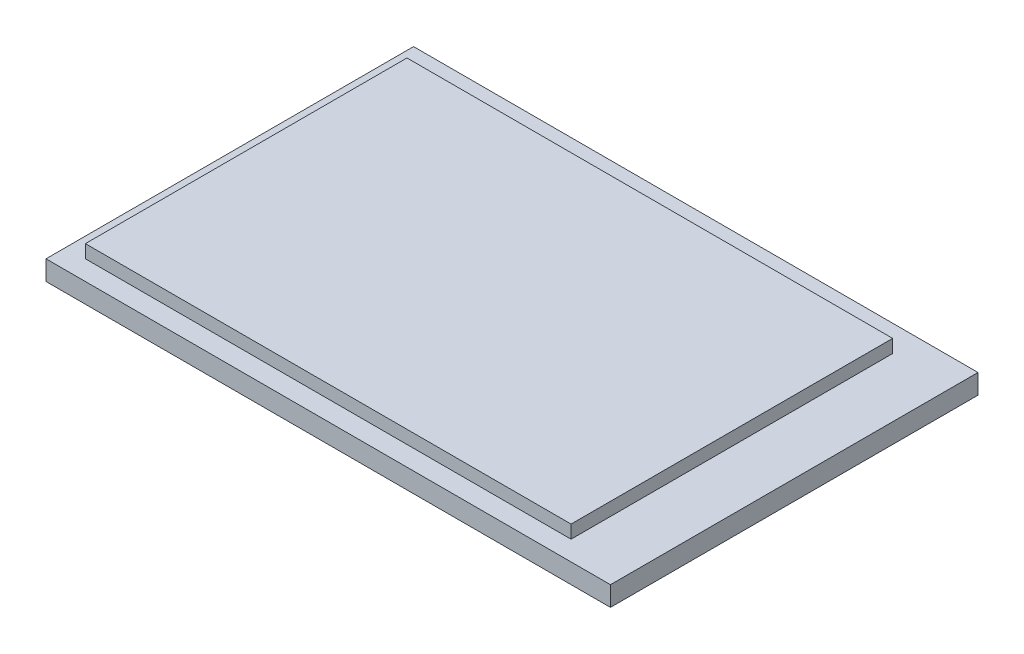
ISO-10303-21;
HEADER;
FILE_DESCRIPTION(('STEP AP214'),'2;1');
FILE_NAME('part.step','',(''),(''),'','','');
FILE_SCHEMA(('AUTOMOTIVE_DESIGN { 1 0 10303 214 1 1 1 1 }'));
ENDSEC;
DATA;
#1=APPLICATION_CONTEXT('core data for automotive mechanical design processes');
#2=APPLICATION_PROTOCOL_DEFINITION('international standard','automotive_design',2000,#1);
#3=PRODUCT_CONTEXT('',#1,'mechanical');
#4=PRODUCT('Part','Part','',(#3));
#5=PRODUCT_RELATED_PRODUCT_CATEGORY('part','',(#4));
#6=PRODUCT_DEFINITION_FORMATION('','',#4);
#7=PRODUCT_DEFINITION_CONTEXT('part definition',#1,'design');
#8=PRODUCT_DEFINITION('design','',#6,#7);
#9=PRODUCT_DEFINITION_SHAPE('','',#8);
#10=(LENGTH_UNIT() NAMED_UNIT(*) SI_UNIT(.MILLI.,.METRE.));
#11=(NAMED_UNIT(*) PLANE_ANGLE_UNIT() SI_UNIT($,.RADIAN.));
#12=(NAMED_UNIT(*) SI_UNIT($,.STERADIAN.) SOLID_ANGLE_UNIT());
#13=UNCERTAINTY_MEASURE_WITH_UNIT(LENGTH_MEASURE(1.E-05),#10,'distance_accuracy_value','');
#14=(GEOMETRIC_REPRESENTATION_CONTEXT(3) GLOBAL_UNCERTAINTY_ASSIGNED_CONTEXT((#13)) GLOBAL_UNIT_ASSIGNED_CONTEXT((#10,
#11,#12)) REPRESENTATION_CONTEXT('',''));
#15=CARTESIAN_POINT('',(0.,0.,0.));
#16=DIRECTION('',(0.,0.,1.));
#17=DIRECTION('',(1.,0.,0.));
#18=AXIS2_PLACEMENT_3D('',#15,#16,#17);
#19=CARTESIAN_POINT('',(46.,-3.,-28.5));
#20=DIRECTION('',(-1.,0.,0.));
#21=DIRECTION('',(0.,0.,1.));
#22=AXIS2_PLACEMENT_3D('',#19,#20,#21);
#23=PLANE('',#22);
#24=DIRECTION('',(0.,0.,1.));
#25=VECTOR('',#24,1.);
#26=CARTESIAN_POINT('',(46.,0.,-28.5));
#27=LINE('',#26,#25);
#28=CARTESIAN_POINT('',(46.,0.,-28.5));
#29=VERTEX_POINT('',#28);
#30=CARTESIAN_POINT('',(46.,0.,27.5));
#31=VERTEX_POINT('',#30);
#32=EDGE_CURVE('E108',#29,#31,#27,.T.);
#33=ORIENTED_EDGE('',*,*,#32,.T.);
#34=DIRECTION('',(0.,1.,0.));
#35=VECTOR('',#34,1.);
#36=CARTESIAN_POINT('',(46.,-3.,27.5));
#37=LINE('',#36,#35);
#38=CARTESIAN_POINT('',(46.,-3.,27.5));
#39=VERTEX_POINT('',#38);
#40=EDGE_CURVE('E12',#39,#31,#37,.T.);
#41=ORIENTED_EDGE('',*,*,#40,.F.);
#42=DIRECTION('',(0.,0.,1.));
#43=VECTOR('',#42,1.);
#44=CARTESIAN_POINT('',(46.,-3.,-28.5));
#45=LINE('',#44,#43);
#46=CARTESIAN_POINT('',(46.,-3.,-28.5));
#47=VERTEX_POINT('',#46);
#48=EDGE_CURVE('E96',#47,#39,#45,.T.);
#49=ORIENTED_EDGE('',*,*,#48,.F.);
#50=DIRECTION('',(0.,1.,0.));
#51=VECTOR('',#50,1.);
#52=CARTESIAN_POINT('',(46.,-3.,-28.5));
#53=LINE('',#52,#51);
#54=EDGE_CURVE('E104',#47,#29,#53,.T.);
#55=ORIENTED_EDGE('',*,*,#54,.T.);
#56=EDGE_LOOP('',(#33,#41,#49,#55));
#57=FACE_BOUND('',#56,.T.);
#58=ADVANCED_FACE('F45',(#57),#23,.F.);
#59=CARTESIAN_POINT('',(-40.,-3.,27.5));
#60=DIRECTION('',(0.,0.,-1.));
#61=DIRECTION('',(-1.,0.,0.));
#62=AXIS2_PLACEMENT_3D('',#59,#60,#61);
#63=PLANE('',#62);
#64=DIRECTION('',(-1.,0.,0.));
#65=VECTOR('',#64,1.);
#66=CARTESIAN_POINT('',(-40.,0.,27.5));
#67=LINE('',#66,#65);
#68=CARTESIAN_POINT('',(-40.,0.,27.5));
#69=VERTEX_POINT('',#68);
#70=EDGE_CURVE('E100',#31,#69,#67,.T.);
#71=ORIENTED_EDGE('',*,*,#70,.T.);
#72=DIRECTION('',(0.,1.,0.));
#73=VECTOR('',#72,1.);
#74=CARTESIAN_POINT('',(-40.,-3.,27.5));
#75=LINE('',#74,#73);
#76=CARTESIAN_POINT('',(-40.,-3.,27.5));
#77=VERTEX_POINT('',#76);
#78=EDGE_CURVE('E53',#77,#69,#75,.T.);
#79=ORIENTED_EDGE('',*,*,#78,.F.);
#80=DIRECTION('',(-1.,0.,0.));
#81=VECTOR('',#80,1.);
#82=CARTESIAN_POINT('',(-40.,-3.,27.5));
#83=LINE('',#82,#81);
#84=EDGE_CURVE('E91',#39,#77,#83,.T.);
#85=ORIENTED_EDGE('',*,*,#84,.F.);
#86=ORIENTED_EDGE('',*,*,#40,.T.);
#87=EDGE_LOOP('',(#71,#79,#85,#86));
#88=FACE_BOUND('',#87,.T.);
#89=ADVANCED_FACE('F99',(#88),#63,.F.);
#90=CARTESIAN_POINT('',(-40.,-3.,-28.5));
#91=DIRECTION('',(1.,0.,0.));
#92=DIRECTION('',(0.,0.,-1.));
#93=AXIS2_PLACEMENT_3D('',#90,#91,#92);
#94=PLANE('',#93);
#95=DIRECTION('',(0.,0.,-1.));
#96=VECTOR('',#95,1.);
#97=CARTESIAN_POINT('',(-40.,0.,-28.5));
#98=LINE('',#97,#96);
#99=CARTESIAN_POINT('',(-40.,0.,-28.5));
#100=VERTEX_POINT('',#99);
#101=EDGE_CURVE('E78',#69,#100,#98,.T.);
#102=ORIENTED_EDGE('',*,*,#101,.T.);
#103=DIRECTION('',(0.,1.,0.));
#104=VECTOR('',#103,1.);
#105=CARTESIAN_POINT('',(-40.,-3.,-28.5));
#106=LINE('',#105,#104);
#107=CARTESIAN_POINT('',(-40.,-3.,-28.5));
#108=VERTEX_POINT('',#107);
#109=EDGE_CURVE('E101',#108,#100,#106,.T.);
#110=ORIENTED_EDGE('',*,*,#109,.F.);
#111=DIRECTION('',(0.,0.,-1.));
#112=VECTOR('',#111,1.);
#113=CARTESIAN_POINT('',(-40.,-3.,-28.5));
#114=LINE('',#113,#112);
#115=EDGE_CURVE('E94',#77,#108,#114,.T.);
#116=ORIENTED_EDGE('',*,*,#115,.F.);
#117=ORIENTED_EDGE('',*,*,#78,.T.);
#118=EDGE_LOOP('',(#102,#110,#116,#117));
#119=FACE_BOUND('',#118,.T.);
#120=ADVANCED_FACE('F102',(#119),#94,.F.);
#121=CARTESIAN_POINT('',(-40.,-3.,-28.5));
#122=DIRECTION('',(0.,0.,1.));
#123=DIRECTION('',(1.,0.,0.));
#124=AXIS2_PLACEMENT_3D('',#121,#122,#123);
#125=PLANE('',#124);
#126=DIRECTION('',(1.,0.,0.));
#127=VECTOR('',#126,1.);
#128=CARTESIAN_POINT('',(-40.,0.,-28.5));
#129=LINE('',#128,#127);
#130=EDGE_CURVE('E84',#100,#29,#129,.T.);
#131=ORIENTED_EDGE('',*,*,#130,.T.);
#132=ORIENTED_EDGE('',*,*,#54,.F.);
#133=DIRECTION('',(1.,0.,0.));
#134=VECTOR('',#133,1.);
#135=CARTESIAN_POINT('',(-40.,-3.,-28.5));
#136=LINE('',#135,#134);
#137=EDGE_CURVE('E61',#108,#47,#136,.T.);
#138=ORIENTED_EDGE('',*,*,#137,.F.);
#139=ORIENTED_EDGE('',*,*,#109,.T.);
#140=EDGE_LOOP('',(#131,#132,#138,#139));
#141=FACE_BOUND('',#140,.T.);
#142=ADVANCED_FACE('F115',(#141),#125,.F.);
#143=CARTESIAN_POINT('',(0.,-3.,0.));
#144=DIRECTION('',(0.,1.,0.));
#145=DIRECTION('',(0.,0.,1.));
#146=AXIS2_PLACEMENT_3D('',#143,#144,#145);
#147=PLANE('',#146);
#148=ORIENTED_EDGE('',*,*,#48,.T.);
#149=ORIENTED_EDGE('',*,*,#84,.T.);
#150=ORIENTED_EDGE('',*,*,#115,.T.);
#151=ORIENTED_EDGE('',*,*,#137,.T.);
#152=EDGE_LOOP('',(#148,#149,#150,#151));
#153=FACE_BOUND('',#152,.T.);
#154=ADVANCED_FACE('F92',(#153),#147,.F.);
#155=CARTESIAN_POINT('',(0.,0.,0.));
#156=DIRECTION('',(0.,1.,0.));
#157=DIRECTION('',(0.,0.,1.));
#158=AXIS2_PLACEMENT_3D('',#155,#156,#157);
#159=PLANE('',#158);
#160=ORIENTED_EDGE('',*,*,#32,.F.);
#161=ORIENTED_EDGE('',*,*,#130,.F.);
#162=ORIENTED_EDGE('',*,*,#101,.F.);
#163=ORIENTED_EDGE('',*,*,#70,.F.);
#164=EDGE_LOOP('',(#160,#161,#162,#163));
#165=FACE_BOUND('',#164,.T.);
#166=ADVANCED_FACE('F118',(#165),#159,.T.);
#167=CLOSED_SHELL('',(#58,#89,#120,#142,#154,#166));
#168=MANIFOLD_SOLID_BREP('B2',#167);
#169=CARTESIAN_POINT('',(37.,2.,24.5));
#170=DIRECTION('',(-1.,0.,0.));
#171=DIRECTION('',(0.,0.,1.));
#172=AXIS2_PLACEMENT_3D('',#169,#170,#171);
#173=PLANE('',#172);
#174=DIRECTION('',(0.,0.,-1.));
#175=VECTOR('',#174,1.);
#176=CARTESIAN_POINT('',(37.,0.,24.5));
#177=LINE('',#176,#175);
#178=CARTESIAN_POINT('',(37.,0.,24.5));
#179=VERTEX_POINT('',#178);
#180=CARTESIAN_POINT('',(37.,0.,-24.5));
#181=VERTEX_POINT('',#180);
#182=EDGE_CURVE('E232',#179,#181,#177,.T.);
#183=ORIENTED_EDGE('',*,*,#182,.T.);
#184=DIRECTION('',(0.,-1.,0.));
#185=VECTOR('',#184,1.);
#186=CARTESIAN_POINT('',(37.,2.,-24.5));
#187=LINE('',#186,#185);
#188=CARTESIAN_POINT('',(37.,2.,-24.5));
#189=VERTEX_POINT('',#188);
#190=EDGE_CURVE('E43',#189,#181,#187,.T.);
#191=ORIENTED_EDGE('',*,*,#190,.F.);
#192=DIRECTION('',(0.,0.,-1.));
#193=VECTOR('',#192,1.);
#194=CARTESIAN_POINT('',(37.,2.,24.5));
#195=LINE('',#194,#193);
#196=CARTESIAN_POINT('',(37.,2.,24.5));
#197=VERTEX_POINT('',#196);
#198=EDGE_CURVE('E220',#197,#189,#195,.T.);
#199=ORIENTED_EDGE('',*,*,#198,.F.);
#200=DIRECTION('',(0.,-1.,0.));
#201=VECTOR('',#200,1.);
#202=CARTESIAN_POINT('',(37.,2.,24.5));
#203=LINE('',#202,#201);
#204=EDGE_CURVE('E228',#197,#179,#203,.T.);
#205=ORIENTED_EDGE('',*,*,#204,.T.);
#206=EDGE_LOOP('',(#183,#191,#199,#205));
#207=FACE_BOUND('',#206,.T.);
#208=ADVANCED_FACE('F169',(#207),#173,.F.);
#209=CARTESIAN_POINT('',(-37.,2.,-24.5));
#210=DIRECTION('',(0.,0.,1.));
#211=DIRECTION('',(1.,0.,0.));
#212=AXIS2_PLACEMENT_3D('',#209,#210,#211);
#213=PLANE('',#212);
#214=DIRECTION('',(-1.,0.,0.));
#215=VECTOR('',#214,1.);
#216=CARTESIAN_POINT('',(-37.,0.,-24.5));
#217=LINE('',#216,#215);
#218=CARTESIAN_POINT('',(-37.,0.,-24.5));
#219=VERTEX_POINT('',#218);
#220=EDGE_CURVE('E224',#181,#219,#217,.T.);
#221=ORIENTED_EDGE('',*,*,#220,.T.);
#222=DIRECTION('',(0.,-1.,0.));
#223=VECTOR('',#222,1.);
#224=CARTESIAN_POINT('',(-37.,2.,-24.5));
#225=LINE('',#224,#223);
#226=CARTESIAN_POINT('',(-37.,2.,-24.5));
#227=VERTEX_POINT('',#226);
#228=EDGE_CURVE('E177',#227,#219,#225,.T.);
#229=ORIENTED_EDGE('',*,*,#228,.F.);
#230=DIRECTION('',(-1.,0.,0.));
#231=VECTOR('',#230,1.);
#232=CARTESIAN_POINT('',(-37.,2.,-24.5));
#233=LINE('',#232,#231);
#234=EDGE_CURVE('E215',#189,#227,#233,.T.);
#235=ORIENTED_EDGE('',*,*,#234,.F.);
#236=ORIENTED_EDGE('',*,*,#190,.T.);
#237=EDGE_LOOP('',(#221,#229,#235,#236));
#238=FACE_BOUND('',#237,.T.);
#239=ADVANCED_FACE('F223',(#238),#213,.F.);
#240=CARTESIAN_POINT('',(-37.,2.,24.5));
#241=DIRECTION('',(1.,0.,0.));
#242=DIRECTION('',(0.,0.,-1.));
#243=AXIS2_PLACEMENT_3D('',#240,#241,#242);
#244=PLANE('',#243);
#245=DIRECTION('',(0.,0.,1.));
#246=VECTOR('',#245,1.);
#247=CARTESIAN_POINT('',(-37.,0.,24.5));
#248=LINE('',#247,#246);
#249=CARTESIAN_POINT('',(-37.,0.,24.5));
#250=VERTEX_POINT('',#249);
#251=EDGE_CURVE('E202',#219,#250,#248,.T.);
#252=ORIENTED_EDGE('',*,*,#251,.T.);
#253=DIRECTION('',(0.,-1.,0.));
#254=VECTOR('',#253,1.);
#255=CARTESIAN_POINT('',(-37.,2.,24.5));
#256=LINE('',#255,#254);
#257=CARTESIAN_POINT('',(-37.,2.,24.5));
#258=VERTEX_POINT('',#257);
#259=EDGE_CURVE('E225',#258,#250,#256,.T.);
#260=ORIENTED_EDGE('',*,*,#259,.F.);
#261=DIRECTION('',(0.,0.,1.));
#262=VECTOR('',#261,1.);
#263=CARTESIAN_POINT('',(-37.,2.,24.5));
#264=LINE('',#263,#262);
#265=EDGE_CURVE('E218',#227,#258,#264,.T.);
#266=ORIENTED_EDGE('',*,*,#265,.F.);
#267=ORIENTED_EDGE('',*,*,#228,.T.);
#268=EDGE_LOOP('',(#252,#260,#266,#267));
#269=FACE_BOUND('',#268,.T.);
#270=ADVANCED_FACE('F226',(#269),#244,.F.);
#271=CARTESIAN_POINT('',(-37.,2.,24.5));
#272=DIRECTION('',(0.,0.,-1.));
#273=DIRECTION('',(-1.,0.,0.));
#274=AXIS2_PLACEMENT_3D('',#271,#272,#273);
#275=PLANE('',#274);
#276=DIRECTION('',(1.,0.,0.));
#277=VECTOR('',#276,1.);
#278=CARTESIAN_POINT('',(-37.,0.,24.5));
#279=LINE('',#278,#277);
#280=EDGE_CURVE('E208',#250,#179,#279,.T.);
#281=ORIENTED_EDGE('',*,*,#280,.T.);
#282=ORIENTED_EDGE('',*,*,#204,.F.);
#283=DIRECTION('',(1.,0.,0.));
#284=VECTOR('',#283,1.);
#285=CARTESIAN_POINT('',(-37.,2.,24.5));
#286=LINE('',#285,#284);
#287=EDGE_CURVE('E185',#258,#197,#286,.T.);
#288=ORIENTED_EDGE('',*,*,#287,.F.);
#289=ORIENTED_EDGE('',*,*,#259,.T.);
#290=EDGE_LOOP('',(#281,#282,#288,#289));
#291=FACE_BOUND('',#290,.T.);
#292=ADVANCED_FACE('F239',(#291),#275,.F.);
#293=CARTESIAN_POINT('',(0.,2.,0.));
#294=DIRECTION('',(0.,-1.,0.));
#295=DIRECTION('',(0.,0.,-1.));
#296=AXIS2_PLACEMENT_3D('',#293,#294,#295);
#297=PLANE('',#296);
#298=ORIENTED_EDGE('',*,*,#198,.T.);
#299=ORIENTED_EDGE('',*,*,#234,.T.);
#300=ORIENTED_EDGE('',*,*,#265,.T.);
#301=ORIENTED_EDGE('',*,*,#287,.T.);
#302=EDGE_LOOP('',(#298,#299,#300,#301));
#303=FACE_BOUND('',#302,.T.);
#304=ADVANCED_FACE('F216',(#303),#297,.F.);
#305=CARTESIAN_POINT('',(0.,0.,0.));
#306=DIRECTION('',(0.,-1.,0.));
#307=DIRECTION('',(0.,0.,-1.));
#308=AXIS2_PLACEMENT_3D('',#305,#306,#307);
#309=PLANE('',#308);
#310=ORIENTED_EDGE('',*,*,#182,.F.);
#311=ORIENTED_EDGE('',*,*,#280,.F.);
#312=ORIENTED_EDGE('',*,*,#251,.F.);
#313=ORIENTED_EDGE('',*,*,#220,.F.);
#314=EDGE_LOOP('',(#310,#311,#312,#313));
#315=FACE_BOUND('',#314,.T.);
#316=ADVANCED_FACE('F242',(#315),#309,.T.);
#317=CLOSED_SHELL('',(#208,#239,#270,#292,#304,#316));
#318=MANIFOLD_SOLID_BREP('B6',#317);
#319=ADVANCED_BREP_SHAPE_REPRESENTATION('',(#18,#168,#318),#14);
#320=SHAPE_DEFINITION_REPRESENTATION(#9,#319);
ENDSEC;
END-ISO-10303-21;
